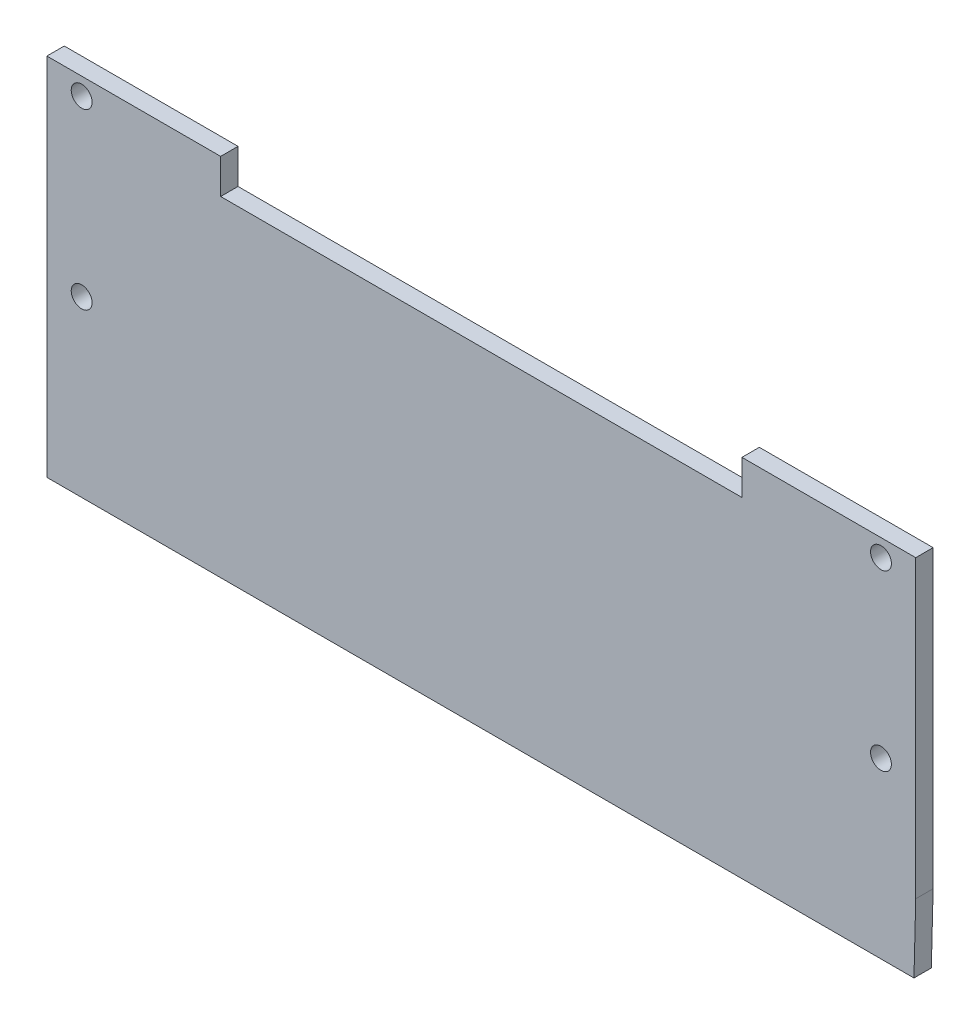
ISO-10303-21;
HEADER;
FILE_DESCRIPTION(('STEP AP214'),'2;1');
FILE_NAME('part.step','',(''),(''),'','','');
FILE_SCHEMA(('AUTOMOTIVE_DESIGN { 1 0 10303 214 1 1 1 1 }'));
ENDSEC;
DATA;
#1=APPLICATION_CONTEXT('core data for automotive mechanical design processes');
#2=APPLICATION_PROTOCOL_DEFINITION('international standard','automotive_design',2000,#1);
#3=PRODUCT_CONTEXT('',#1,'mechanical');
#4=PRODUCT('Part','Part','',(#3));
#5=PRODUCT_RELATED_PRODUCT_CATEGORY('part','',(#4));
#6=PRODUCT_DEFINITION_FORMATION('','',#4);
#7=PRODUCT_DEFINITION_CONTEXT('part definition',#1,'design');
#8=PRODUCT_DEFINITION('design','',#6,#7);
#9=PRODUCT_DEFINITION_SHAPE('','',#8);
#10=(LENGTH_UNIT() NAMED_UNIT(*) SI_UNIT(.MILLI.,.METRE.));
#11=(NAMED_UNIT(*) PLANE_ANGLE_UNIT() SI_UNIT($,.RADIAN.));
#12=(NAMED_UNIT(*) SI_UNIT($,.STERADIAN.) SOLID_ANGLE_UNIT());
#13=UNCERTAINTY_MEASURE_WITH_UNIT(LENGTH_MEASURE(1.E-05),#10,'distance_accuracy_value','');
#14=(GEOMETRIC_REPRESENTATION_CONTEXT(3) GLOBAL_UNCERTAINTY_ASSIGNED_CONTEXT((#13)) GLOBAL_UNIT_ASSIGNED_CONTEXT((#10,
#11,#12)) REPRESENTATION_CONTEXT('',''));
#15=CARTESIAN_POINT('',(0.,0.,0.));
#16=DIRECTION('',(0.,0.,1.));
#17=DIRECTION('',(1.,0.,0.));
#18=AXIS2_PLACEMENT_3D('',#15,#16,#17);
#19=CARTESIAN_POINT('',(0.,0.,5.));
#20=DIRECTION('',(0.,-1.,0.));
#21=DIRECTION('',(0.,0.,-1.));
#22=AXIS2_PLACEMENT_3D('',#19,#20,#21);
#23=PLANE('',#22);
#24=DIRECTION('',(-1.,0.,0.));
#25=VECTOR('',#24,1.);
#26=CARTESIAN_POINT('',(0.,0.,5.));
#27=LINE('',#26,#25);
#28=CARTESIAN_POINT('',(50.,0.,5.));
#29=VERTEX_POINT('',#28);
#30=CARTESIAN_POINT('',(0.,0.,5.));
#31=VERTEX_POINT('',#30);
#32=EDGE_CURVE('E57',#29,#31,#27,.T.);
#33=ORIENTED_EDGE('',*,*,#32,.F.);
#34=DIRECTION('',(0.,0.,-1.));
#35=VECTOR('',#34,1.);
#36=CARTESIAN_POINT('',(50.,0.,5.));
#37=LINE('',#36,#35);
#38=CARTESIAN_POINT('',(50.,0.,0.));
#39=VERTEX_POINT('',#38);
#40=EDGE_CURVE('E11',#29,#39,#37,.T.);
#41=ORIENTED_EDGE('',*,*,#40,.T.);
#42=DIRECTION('',(-1.,0.,0.));
#43=VECTOR('',#42,1.);
#44=CARTESIAN_POINT('',(0.,0.,0.));
#45=LINE('',#44,#43);
#46=CARTESIAN_POINT('',(0.,0.,0.));
#47=VERTEX_POINT('',#46);
#48=EDGE_CURVE('E74',#39,#47,#45,.T.);
#49=ORIENTED_EDGE('',*,*,#48,.T.);
#50=DIRECTION('',(0.,0.,-1.));
#51=VECTOR('',#50,1.);
#52=CARTESIAN_POINT('',(0.,0.,5.));
#53=LINE('',#52,#51);
#54=EDGE_CURVE('E135',#31,#47,#53,.T.);
#55=ORIENTED_EDGE('',*,*,#54,.F.);
#56=EDGE_LOOP('',(#33,#41,#49,#55));
#57=FACE_BOUND('',#56,.T.);
#58=ADVANCED_FACE('F33',(#57),#23,.F.);
#59=CARTESIAN_POINT('',(0.,0.,5.));
#60=DIRECTION('',(0.,0.,1.));
#61=DIRECTION('',(1.,0.,0.));
#62=AXIS2_PLACEMENT_3D('',#59,#60,#61);
#63=PLANE('',#62);
#64=DIRECTION('',(0.,-1.,0.));
#65=VECTOR('',#64,1.);
#66=CARTESIAN_POINT('',(50.,1.38777878078144E-13,5.));
#67=LINE('',#66,#65);
#68=CARTESIAN_POINT('',(50.,-10.,5.));
#69=VERTEX_POINT('',#68);
#70=EDGE_CURVE('E188',#29,#69,#67,.T.);
#71=ORIENTED_EDGE('',*,*,#70,.F.);
#72=ORIENTED_EDGE('',*,*,#32,.T.);
#73=DIRECTION('',(0.,-1.,0.));
#74=VECTOR('',#73,1.);
#75=CARTESIAN_POINT('',(0.,0.,5.));
#76=LINE('',#75,#74);
#77=CARTESIAN_POINT('',(0.,-105.,5.));
#78=VERTEX_POINT('',#77);
#79=EDGE_CURVE('E131',#31,#78,#76,.T.);
#80=ORIENTED_EDGE('',*,*,#79,.T.);
#81=DIRECTION('',(1.,0.,0.));
#82=VECTOR('',#81,1.);
#83=CARTESIAN_POINT('',(0.,-105.,5.));
#84=LINE('',#83,#82);
#85=CARTESIAN_POINT('',(249.491359447026,-105.,5.));
#86=VERTEX_POINT('',#85);
#87=EDGE_CURVE('E174',#78,#86,#84,.T.);
#88=ORIENTED_EDGE('',*,*,#87,.T.);
#89=DIRECTION('',(0.0254238070706872,0.999676762775865,0.));
#90=VECTOR('',#89,1.);
#91=CARTESIAN_POINT('',(249.491359447026,-105.,5.));
#92=LINE('',#91,#90);
#93=CARTESIAN_POINT('',(250.,-85.,5.));
#94=VERTEX_POINT('',#93);
#95=EDGE_CURVE('E183',#86,#94,#92,.T.);
#96=ORIENTED_EDGE('',*,*,#95,.T.);
#97=DIRECTION('',(0.,1.,0.));
#98=VECTOR('',#97,1.);
#99=CARTESIAN_POINT('',(250.,0.,5.));
#100=LINE('',#99,#98);
#101=CARTESIAN_POINT('',(250.,0.,5.));
#102=VERTEX_POINT('',#101);
#103=EDGE_CURVE('E79',#94,#102,#100,.T.);
#104=ORIENTED_EDGE('',*,*,#103,.T.);
#105=CARTESIAN_POINT('',(200.,0.,5.));
#106=VERTEX_POINT('',#105);
#107=EDGE_CURVE('E138',#102,#106,#27,.T.);
#108=ORIENTED_EDGE('',*,*,#107,.T.);
#109=DIRECTION('',(0.,1.,0.));
#110=VECTOR('',#109,1.);
#111=CARTESIAN_POINT('',(200.,0.,5.));
#112=LINE('',#111,#110);
#113=CARTESIAN_POINT('',(200.,-10.,5.));
#114=VERTEX_POINT('',#113);
#115=EDGE_CURVE('E48',#114,#106,#112,.T.);
#116=ORIENTED_EDGE('',*,*,#115,.F.);
#117=DIRECTION('',(1.,0.,0.));
#118=VECTOR('',#117,1.);
#119=CARTESIAN_POINT('',(0.,-10.,5.));
#120=LINE('',#119,#118);
#121=EDGE_CURVE('E184',#69,#114,#120,.T.);
#122=ORIENTED_EDGE('',*,*,#121,.F.);
#123=EDGE_LOOP('',(#71,#72,#80,#88,#96,#104,#108,#116,#122));
#124=FACE_BOUND('',#123,.T.);
#125=CARTESIAN_POINT('',(240.,-55.,5.));
#126=DIRECTION('',(0.,0.,1.));
#127=DIRECTION('',(-1.,0.,0.));
#128=AXIS2_PLACEMENT_3D('',#125,#126,#127);
#129=CIRCLE('',#128,2.99999999999999);
#130=CARTESIAN_POINT('',(237.,-55.,5.));
#131=VERTEX_POINT('',#130);
#132=EDGE_CURVE('E201',#131,#131,#129,.T.);
#133=ORIENTED_EDGE('',*,*,#132,.F.);
#134=EDGE_LOOP('',(#133));
#135=FACE_BOUND('',#134,.T.);
#136=CARTESIAN_POINT('',(10.,-5.,5.));
#137=DIRECTION('',(0.,0.,1.));
#138=DIRECTION('',(1.,0.,0.));
#139=AXIS2_PLACEMENT_3D('',#136,#137,#138);
#140=CIRCLE('',#139,3.);
#141=CARTESIAN_POINT('',(13.,-5.,5.));
#142=VERTEX_POINT('',#141);
#143=EDGE_CURVE('E156',#142,#142,#140,.T.);
#144=ORIENTED_EDGE('',*,*,#143,.F.);
#145=EDGE_LOOP('',(#144));
#146=FACE_BOUND('',#145,.T.);
#147=CARTESIAN_POINT('',(10.,-55.,5.));
#148=DIRECTION('',(0.,0.,1.));
#149=DIRECTION('',(1.,0.,0.));
#150=AXIS2_PLACEMENT_3D('',#147,#148,#149);
#151=CIRCLE('',#150,3.);
#152=CARTESIAN_POINT('',(13.,-55.,5.));
#153=VERTEX_POINT('',#152);
#154=EDGE_CURVE('E166',#153,#153,#151,.T.);
#155=ORIENTED_EDGE('',*,*,#154,.F.);
#156=EDGE_LOOP('',(#155));
#157=FACE_BOUND('',#156,.T.);
#158=CARTESIAN_POINT('',(240.,-5.,5.));
#159=DIRECTION('',(0.,0.,1.));
#160=DIRECTION('',(-1.,0.,0.));
#161=AXIS2_PLACEMENT_3D('',#158,#159,#160);
#162=CIRCLE('',#161,3.00000000000002);
#163=CARTESIAN_POINT('',(237.,-5.,5.));
#164=VERTEX_POINT('',#163);
#165=EDGE_CURVE('E195',#164,#164,#162,.T.);
#166=ORIENTED_EDGE('',*,*,#165,.F.);
#167=EDGE_LOOP('',(#166));
#168=FACE_BOUND('',#167,.T.);
#169=ADVANCED_FACE('F149',(#124,#135,#146,#157,#168),#63,.T.);
#170=CARTESIAN_POINT('',(0.,0.,0.));
#171=DIRECTION('',(0.,0.,1.));
#172=DIRECTION('',(1.,0.,0.));
#173=AXIS2_PLACEMENT_3D('',#170,#171,#172);
#174=PLANE('',#173);
#175=ORIENTED_EDGE('',*,*,#48,.F.);
#176=DIRECTION('',(0.,1.,0.));
#177=VECTOR('',#176,1.);
#178=CARTESIAN_POINT('',(50.,-10.,0.));
#179=LINE('',#178,#177);
#180=CARTESIAN_POINT('',(50.,-10.,0.));
#181=VERTEX_POINT('',#180);
#182=EDGE_CURVE('E113',#181,#39,#179,.T.);
#183=ORIENTED_EDGE('',*,*,#182,.F.);
#184=DIRECTION('',(-1.,0.,0.));
#185=VECTOR('',#184,1.);
#186=CARTESIAN_POINT('',(200.,-10.,0.));
#187=LINE('',#186,#185);
#188=CARTESIAN_POINT('',(200.,-10.,0.));
#189=VERTEX_POINT('',#188);
#190=EDGE_CURVE('E244',#189,#181,#187,.T.);
#191=ORIENTED_EDGE('',*,*,#190,.F.);
#192=DIRECTION('',(0.,-1.,0.));
#193=VECTOR('',#192,1.);
#194=CARTESIAN_POINT('',(200.,0.,0.));
#195=LINE('',#194,#193);
#196=CARTESIAN_POINT('',(200.,0.,0.));
#197=VERTEX_POINT('',#196);
#198=EDGE_CURVE('E120',#197,#189,#195,.T.);
#199=ORIENTED_EDGE('',*,*,#198,.F.);
#200=CARTESIAN_POINT('',(250.,0.,0.));
#201=VERTEX_POINT('',#200);
#202=EDGE_CURVE('E127',#201,#197,#45,.T.);
#203=ORIENTED_EDGE('',*,*,#202,.F.);
#204=DIRECTION('',(0.,1.,0.));
#205=VECTOR('',#204,1.);
#206=CARTESIAN_POINT('',(250.,0.,0.));
#207=LINE('',#206,#205);
#208=CARTESIAN_POINT('',(250.,-85.,0.));
#209=VERTEX_POINT('',#208);
#210=EDGE_CURVE('E128',#209,#201,#207,.T.);
#211=ORIENTED_EDGE('',*,*,#210,.F.);
#212=DIRECTION('',(0.0254238070706872,0.999676762775865,0.));
#213=VECTOR('',#212,1.);
#214=CARTESIAN_POINT('',(249.491359447026,-105.,0.));
#215=LINE('',#214,#213);
#216=CARTESIAN_POINT('',(249.491359447026,-105.,0.));
#217=VERTEX_POINT('',#216);
#218=EDGE_CURVE('E180',#217,#209,#215,.T.);
#219=ORIENTED_EDGE('',*,*,#218,.F.);
#220=DIRECTION('',(1.,0.,0.));
#221=VECTOR('',#220,1.);
#222=CARTESIAN_POINT('',(0.,-105.,0.));
#223=LINE('',#222,#221);
#224=CARTESIAN_POINT('',(0.,-105.,0.));
#225=VERTEX_POINT('',#224);
#226=EDGE_CURVE('E186',#225,#217,#223,.T.);
#227=ORIENTED_EDGE('',*,*,#226,.F.);
#228=DIRECTION('',(0.,-1.,0.));
#229=VECTOR('',#228,1.);
#230=CARTESIAN_POINT('',(0.,0.,0.));
#231=LINE('',#230,#229);
#232=EDGE_CURVE('E126',#47,#225,#231,.T.);
#233=ORIENTED_EDGE('',*,*,#232,.F.);
#234=EDGE_LOOP('',(#175,#183,#191,#199,#203,#211,#219,#227,#233));
#235=FACE_BOUND('',#234,.T.);
#236=CARTESIAN_POINT('',(10.,-5.,0.));
#237=DIRECTION('',(0.,0.,1.));
#238=DIRECTION('',(1.,0.,0.));
#239=AXIS2_PLACEMENT_3D('',#236,#237,#238);
#240=CIRCLE('',#239,3.);
#241=CARTESIAN_POINT('',(13.,-5.,0.));
#242=VERTEX_POINT('',#241);
#243=EDGE_CURVE('E161',#242,#242,#240,.T.);
#244=ORIENTED_EDGE('',*,*,#243,.T.);
#245=EDGE_LOOP('',(#244));
#246=FACE_BOUND('',#245,.T.);
#247=CARTESIAN_POINT('',(10.,-55.,0.));
#248=DIRECTION('',(0.,0.,1.));
#249=DIRECTION('',(1.,0.,0.));
#250=AXIS2_PLACEMENT_3D('',#247,#248,#249);
#251=CIRCLE('',#250,3.);
#252=CARTESIAN_POINT('',(13.,-55.,0.));
#253=VERTEX_POINT('',#252);
#254=EDGE_CURVE('E169',#253,#253,#251,.T.);
#255=ORIENTED_EDGE('',*,*,#254,.T.);
#256=EDGE_LOOP('',(#255));
#257=FACE_BOUND('',#256,.T.);
#258=CARTESIAN_POINT('',(240.,-55.,0.));
#259=DIRECTION('',(0.,0.,1.));
#260=DIRECTION('',(-1.,0.,0.));
#261=AXIS2_PLACEMENT_3D('',#258,#259,#260);
#262=CIRCLE('',#261,2.99999999999999);
#263=CARTESIAN_POINT('',(237.,-55.,0.));
#264=VERTEX_POINT('',#263);
#265=EDGE_CURVE('E198',#264,#264,#262,.T.);
#266=ORIENTED_EDGE('',*,*,#265,.T.);
#267=EDGE_LOOP('',(#266));
#268=FACE_BOUND('',#267,.T.);
#269=CARTESIAN_POINT('',(240.,-5.,0.));
#270=DIRECTION('',(0.,0.,1.));
#271=DIRECTION('',(-1.,0.,0.));
#272=AXIS2_PLACEMENT_3D('',#269,#270,#271);
#273=CIRCLE('',#272,3.00000000000002);
#274=CARTESIAN_POINT('',(237.,-5.,0.));
#275=VERTEX_POINT('',#274);
#276=EDGE_CURVE('E193',#275,#275,#273,.T.);
#277=ORIENTED_EDGE('',*,*,#276,.T.);
#278=EDGE_LOOP('',(#277));
#279=FACE_BOUND('',#278,.T.);
#280=ADVANCED_FACE('F123',(#235,#246,#257,#268,#279),#174,.F.);
#281=CARTESIAN_POINT('',(0.,0.,5.));
#282=DIRECTION('',(1.,0.,0.));
#283=DIRECTION('',(0.,1.,0.));
#284=AXIS2_PLACEMENT_3D('',#281,#282,#283);
#285=PLANE('',#284);
#286=ORIENTED_EDGE('',*,*,#232,.T.);
#287=DIRECTION('',(0.,0.,1.));
#288=VECTOR('',#287,1.);
#289=CARTESIAN_POINT('',(0.,-105.,0.));
#290=LINE('',#289,#288);
#291=EDGE_CURVE('E176',#225,#78,#290,.T.);
#292=ORIENTED_EDGE('',*,*,#291,.T.);
#293=ORIENTED_EDGE('',*,*,#79,.F.);
#294=ORIENTED_EDGE('',*,*,#54,.T.);
#295=EDGE_LOOP('',(#286,#292,#293,#294));
#296=FACE_BOUND('',#295,.T.);
#297=ADVANCED_FACE('F35',(#296),#285,.F.);
#298=CARTESIAN_POINT('',(250.,0.,5.));
#299=DIRECTION('',(-1.,0.,0.));
#300=DIRECTION('',(0.,0.,1.));
#301=AXIS2_PLACEMENT_3D('',#298,#299,#300);
#302=PLANE('',#301);
#303=ORIENTED_EDGE('',*,*,#210,.T.);
#304=DIRECTION('',(0.,0.,-1.));
#305=VECTOR('',#304,1.);
#306=CARTESIAN_POINT('',(250.,0.,5.));
#307=LINE('',#306,#305);
#308=EDGE_CURVE('E137',#102,#201,#307,.T.);
#309=ORIENTED_EDGE('',*,*,#308,.F.);
#310=ORIENTED_EDGE('',*,*,#103,.F.);
#311=DIRECTION('',(0.,0.,-1.));
#312=VECTOR('',#311,1.);
#313=CARTESIAN_POINT('',(250.,-85.,5.));
#314=LINE('',#313,#312);
#315=EDGE_CURVE('E141',#94,#209,#314,.T.);
#316=ORIENTED_EDGE('',*,*,#315,.T.);
#317=EDGE_LOOP('',(#303,#309,#310,#316));
#318=FACE_BOUND('',#317,.T.);
#319=ADVANCED_FACE('F234',(#318),#302,.F.);
#320=ORIENTED_EDGE('',*,*,#202,.T.);
#321=DIRECTION('',(0.,0.,1.));
#322=VECTOR('',#321,1.);
#323=CARTESIAN_POINT('',(200.,0.,5.));
#324=LINE('',#323,#322);
#325=EDGE_CURVE('E41',#197,#106,#324,.T.);
#326=ORIENTED_EDGE('',*,*,#325,.T.);
#327=ORIENTED_EDGE('',*,*,#107,.F.);
#328=ORIENTED_EDGE('',*,*,#308,.T.);
#329=EDGE_LOOP('',(#320,#326,#327,#328));
#330=FACE_BOUND('',#329,.T.);
#331=ADVANCED_FACE('F145',(#330),#23,.F.);
#332=CARTESIAN_POINT('',(10.,-5.,5.));
#333=DIRECTION('',(0.,0.,-1.));
#334=DIRECTION('',(-1.,0.,0.));
#335=AXIS2_PLACEMENT_3D('',#332,#333,#334);
#336=CYLINDRICAL_SURFACE('',#335,3.);
#337=ORIENTED_EDGE('',*,*,#143,.T.);
#338=EDGE_LOOP('',(#337));
#339=FACE_BOUND('',#338,.T.);
#340=ORIENTED_EDGE('',*,*,#243,.F.);
#341=EDGE_LOOP('',(#340));
#342=FACE_BOUND('',#341,.T.);
#343=ADVANCED_FACE('F216',(#339,#342),#336,.F.);
#344=CARTESIAN_POINT('',(10.,-55.,5.));
#345=DIRECTION('',(0.,0.,-1.));
#346=DIRECTION('',(-1.,0.,0.));
#347=AXIS2_PLACEMENT_3D('',#344,#345,#346);
#348=CYLINDRICAL_SURFACE('',#347,3.);
#349=ORIENTED_EDGE('',*,*,#154,.T.);
#350=EDGE_LOOP('',(#349));
#351=FACE_BOUND('',#350,.T.);
#352=ORIENTED_EDGE('',*,*,#254,.F.);
#353=EDGE_LOOP('',(#352));
#354=FACE_BOUND('',#353,.T.);
#355=ADVANCED_FACE('F213',(#351,#354),#348,.F.);
#356=CARTESIAN_POINT('',(240.,-55.,5.));
#357=DIRECTION('',(0.,0.,-1.));
#358=DIRECTION('',(-1.,0.,0.));
#359=AXIS2_PLACEMENT_3D('',#356,#357,#358);
#360=CYLINDRICAL_SURFACE('',#359,2.99999999999999);
#361=ORIENTED_EDGE('',*,*,#132,.T.);
#362=EDGE_LOOP('',(#361));
#363=FACE_BOUND('',#362,.T.);
#364=ORIENTED_EDGE('',*,*,#265,.F.);
#365=EDGE_LOOP('',(#364));
#366=FACE_BOUND('',#365,.T.);
#367=ADVANCED_FACE('F215',(#363,#366),#360,.F.);
#368=CARTESIAN_POINT('',(240.,-5.,5.));
#369=DIRECTION('',(0.,0.,-1.));
#370=DIRECTION('',(-1.,0.,0.));
#371=AXIS2_PLACEMENT_3D('',#368,#369,#370);
#372=CYLINDRICAL_SURFACE('',#371,3.00000000000002);
#373=ORIENTED_EDGE('',*,*,#165,.T.);
#374=EDGE_LOOP('',(#373));
#375=FACE_BOUND('',#374,.T.);
#376=ORIENTED_EDGE('',*,*,#276,.F.);
#377=EDGE_LOOP('',(#376));
#378=FACE_BOUND('',#377,.T.);
#379=ADVANCED_FACE('F222',(#375,#378),#372,.F.);
#380=CARTESIAN_POINT('',(249.491359447026,-105.,0.));
#381=DIRECTION('',(0.999676762775865,-0.0254238070706872,0.));
#382=DIRECTION('',(0.0254238070706872,0.999676762775865,0.));
#383=AXIS2_PLACEMENT_3D('',#380,#381,#382);
#384=PLANE('',#383);
#385=ORIENTED_EDGE('',*,*,#95,.F.);
#386=DIRECTION('',(0.,0.,1.));
#387=VECTOR('',#386,1.);
#388=CARTESIAN_POINT('',(249.491359447026,-105.,0.));
#389=LINE('',#388,#387);
#390=EDGE_CURVE('E179',#217,#86,#389,.T.);
#391=ORIENTED_EDGE('',*,*,#390,.F.);
#392=ORIENTED_EDGE('',*,*,#218,.T.);
#393=ORIENTED_EDGE('',*,*,#315,.F.);
#394=EDGE_LOOP('',(#385,#391,#392,#393));
#395=FACE_BOUND('',#394,.T.);
#396=ADVANCED_FACE('F253',(#395),#384,.T.);
#397=CARTESIAN_POINT('',(0.,-105.,0.));
#398=DIRECTION('',(0.,-1.,0.));
#399=DIRECTION('',(0.,0.,-1.));
#400=AXIS2_PLACEMENT_3D('',#397,#398,#399);
#401=PLANE('',#400);
#402=ORIENTED_EDGE('',*,*,#87,.F.);
#403=ORIENTED_EDGE('',*,*,#291,.F.);
#404=ORIENTED_EDGE('',*,*,#226,.T.);
#405=ORIENTED_EDGE('',*,*,#390,.T.);
#406=EDGE_LOOP('',(#402,#403,#404,#405));
#407=FACE_BOUND('',#406,.T.);
#408=ADVANCED_FACE('F182',(#407),#401,.T.);
#409=CARTESIAN_POINT('',(50.,-10.,10.));
#410=DIRECTION('',(-1.,0.,0.));
#411=DIRECTION('',(0.,-1.,0.));
#412=AXIS2_PLACEMENT_3D('',#409,#410,#411);
#413=PLANE('',#412);
#414=ORIENTED_EDGE('',*,*,#70,.T.);
#415=DIRECTION('',(0.,0.,-1.));
#416=VECTOR('',#415,1.);
#417=CARTESIAN_POINT('',(50.,-10.,10.));
#418=LINE('',#417,#416);
#419=EDGE_CURVE('E116',#69,#181,#418,.T.);
#420=ORIENTED_EDGE('',*,*,#419,.T.);
#421=ORIENTED_EDGE('',*,*,#182,.T.);
#422=ORIENTED_EDGE('',*,*,#40,.F.);
#423=EDGE_LOOP('',(#414,#420,#421,#422));
#424=FACE_BOUND('',#423,.T.);
#425=ADVANCED_FACE('F114',(#424),#413,.F.);
#426=CARTESIAN_POINT('',(200.,-10.,10.));
#427=DIRECTION('',(0.,-1.,0.));
#428=DIRECTION('',(0.,0.,-1.));
#429=AXIS2_PLACEMENT_3D('',#426,#427,#428);
#430=PLANE('',#429);
#431=ORIENTED_EDGE('',*,*,#121,.T.);
#432=DIRECTION('',(0.,0.,-1.));
#433=VECTOR('',#432,1.);
#434=CARTESIAN_POINT('',(200.,-10.,10.));
#435=LINE('',#434,#433);
#436=EDGE_CURVE('E246',#114,#189,#435,.T.);
#437=ORIENTED_EDGE('',*,*,#436,.T.);
#438=ORIENTED_EDGE('',*,*,#190,.T.);
#439=ORIENTED_EDGE('',*,*,#419,.F.);
#440=EDGE_LOOP('',(#431,#437,#438,#439));
#441=FACE_BOUND('',#440,.T.);
#442=ADVANCED_FACE('F266',(#441),#430,.F.);
#443=CARTESIAN_POINT('',(200.,0.,10.));
#444=DIRECTION('',(1.,0.,0.));
#445=DIRECTION('',(0.,0.,-1.));
#446=AXIS2_PLACEMENT_3D('',#443,#444,#445);
#447=PLANE('',#446);
#448=ORIENTED_EDGE('',*,*,#115,.T.);
#449=ORIENTED_EDGE('',*,*,#325,.F.);
#450=ORIENTED_EDGE('',*,*,#198,.T.);
#451=ORIENTED_EDGE('',*,*,#436,.F.);
#452=EDGE_LOOP('',(#448,#449,#450,#451));
#453=FACE_BOUND('',#452,.T.);
#454=ADVANCED_FACE('F267',(#453),#447,.F.);
#455=CLOSED_SHELL('',(#58,#169,#280,#297,#319,#331,#343,#355,#367,#379,#396,#408,#425,#442,#454));
#456=MANIFOLD_SOLID_BREP('B2',#455);
#457=ADVANCED_BREP_SHAPE_REPRESENTATION('',(#18,#456),#14);
#458=SHAPE_DEFINITION_REPRESENTATION(#9,#457);
ENDSEC;
END-ISO-10303-21;
